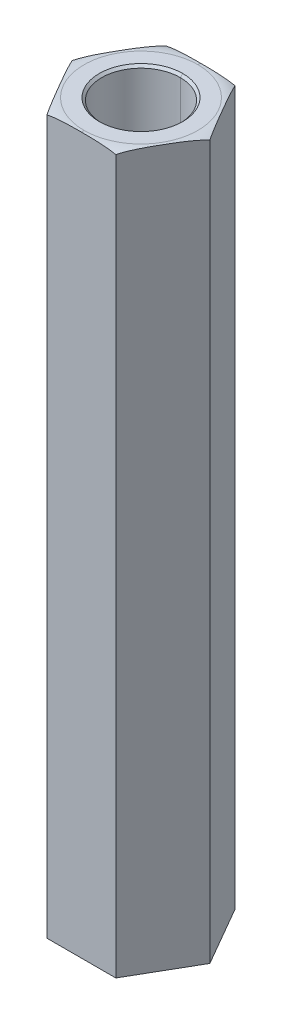
ISO-10303-21;
HEADER;
FILE_DESCRIPTION(('STEP AP214'),'2;1');
FILE_NAME('part.step','',(''),(''),'','','');
FILE_SCHEMA(('AUTOMOTIVE_DESIGN { 1 0 10303 214 1 1 1 1 }'));
ENDSEC;
DATA;
#1=APPLICATION_CONTEXT('core data for automotive mechanical design processes');
#2=APPLICATION_PROTOCOL_DEFINITION('international standard','automotive_design',2000,#1);
#3=PRODUCT_CONTEXT('',#1,'mechanical');
#4=PRODUCT('Part','Part','',(#3));
#5=PRODUCT_RELATED_PRODUCT_CATEGORY('part','',(#4));
#6=PRODUCT_DEFINITION_FORMATION('','',#4);
#7=PRODUCT_DEFINITION_CONTEXT('part definition',#1,'design');
#8=PRODUCT_DEFINITION('design','',#6,#7);
#9=PRODUCT_DEFINITION_SHAPE('','',#8);
#10=(LENGTH_UNIT() NAMED_UNIT(*) SI_UNIT(.MILLI.,.METRE.));
#11=(NAMED_UNIT(*) PLANE_ANGLE_UNIT() SI_UNIT($,.RADIAN.));
#12=(NAMED_UNIT(*) SI_UNIT($,.STERADIAN.) SOLID_ANGLE_UNIT());
#13=UNCERTAINTY_MEASURE_WITH_UNIT(LENGTH_MEASURE(1.E-05),#10,'distance_accuracy_value','');
#14=(GEOMETRIC_REPRESENTATION_CONTEXT(3) GLOBAL_UNCERTAINTY_ASSIGNED_CONTEXT((#13)) GLOBAL_UNIT_ASSIGNED_CONTEXT((#10,
#11,#12)) REPRESENTATION_CONTEXT('',''));
#15=CARTESIAN_POINT('',(0.,0.,0.));
#16=DIRECTION('',(0.,0.,1.));
#17=DIRECTION('',(1.,0.,0.));
#18=AXIS2_PLACEMENT_3D('',#15,#16,#17);
#19=CARTESIAN_POINT('',(-3.66617420935412,76.2,0.));
#20=DIRECTION('',(0.866025403784439,0.,-0.5));
#21=DIRECTION('',(0.,-1.,0.));
#22=AXIS2_PLACEMENT_3D('',#19,#20,#21);
#23=PLANE('',#22);
#24=DIRECTION('',(-0.5,0.,-0.866025403784439));
#25=VECTOR('',#24,1.);
#26=CARTESIAN_POINT('',(-3.66617420935412,38.1,0.));
#27=LINE('',#26,#25);
#28=CARTESIAN_POINT('',(-1.83308710467708,38.1,3.175));
#29=VERTEX_POINT('',#28);
#30=CARTESIAN_POINT('',(-3.66617420935413,38.1,0.));
#31=VERTEX_POINT('',#30);
#32=EDGE_CURVE('E387',#29,#31,#27,.T.);
#33=ORIENTED_EDGE('',*,*,#32,.F.);
#34=DIRECTION('',(0.,1.,0.));
#35=VECTOR('',#34,1.);
#36=CARTESIAN_POINT('',(-1.83308710467708,76.2,3.175));
#37=LINE('',#36,#35);
#38=CARTESIAN_POINT('',(-1.83308710467706,76.073,3.175));
#39=VERTEX_POINT('',#38);
#40=EDGE_CURVE('E57',#29,#39,#37,.T.);
#41=ORIENTED_EDGE('',*,*,#40,.T.);
#42=CARTESIAN_POINT('',(-3.66617420935412,76.073,0.));
#43=CARTESIAN_POINT('',(-3.62852752777413,76.0886774888161,0.0651650175844497));
#44=CARTESIAN_POINT('',(-3.59063825645809,76.1021129162483,0.130678095569553));
#45=CARTESIAN_POINT('',(-3.51465366955102,76.1252207927488,0.262081945129717));
#46=CARTESIAN_POINT('',(-3.47655888890391,76.1349004136586,0.32797175062727));
#47=CARTESIAN_POINT('',(-3.40028117866843,76.1512755376251,0.460088482912216));
#48=CARTESIAN_POINT('',(-3.36209822004462,76.1579698521673,0.526315533370278));
#49=CARTESIAN_POINT('',(-3.28553703394474,76.1690985676939,0.659145882122327));
#50=CARTESIAN_POINT('',(-3.24715858676475,76.173525109243,0.72574969079345));
#51=CARTESIAN_POINT('',(-3.17013720645552,76.1807232490973,0.859167969028904));
#52=CARTESIAN_POINT('',(-3.1314938213222,76.1834896133415,0.925982444133844));
#53=CARTESIAN_POINT('',(-3.05461275530814,76.187809359476,1.05897157909141));
#54=CARTESIAN_POINT('',(-3.01637496107305,76.1893748391711,1.12514580542029));
#55=CARTESIAN_POINT('',(-2.94010013043662,76.1917123281715,1.25726766896534));
#56=CARTESIAN_POINT('',(-2.9020629053945,76.1924875053469,1.3232151463295));
#57=CARTESIAN_POINT('',(-2.82590963462342,76.1934934801607,1.45528703761391));
#58=CARTESIAN_POINT('',(-2.78779362824686,76.1937229185725,1.52141148352469));
#59=CARTESIAN_POINT('',(-2.71134080607808,76.1937239313039,1.65380824205224));
#60=CARTESIAN_POINT('',(-2.67300367247286,76.1934940728267,1.72008037116131));
#61=CARTESIAN_POINT('',(-2.59652315428835,76.1924847717044,1.85233139266062));
#62=CARTESIAN_POINT('',(-2.55837968024612,76.1917078287948,1.91831025043496));
#63=CARTESIAN_POINT('',(-2.48204443723343,76.1893627996394,2.05051676476466));
#64=CARTESIAN_POINT('',(-2.4438529218735,76.1877921203691,2.11674452604261));
#65=CARTESIAN_POINT('',(-2.36710568333616,76.1834548824334,2.24991554859907));
#66=CARTESIAN_POINT('',(-2.32855052590926,76.1806754800541,2.31685874328981));
#67=CARTESIAN_POINT('',(-2.25097444995731,76.1734136053112,2.45117109158841));
#68=CARTESIAN_POINT('',(-2.21195240767693,76.1689164456647,2.5185388478012));
#69=CARTESIAN_POINT('',(-2.13461656999061,76.1576448518415,2.65211930950646));
#70=CARTESIAN_POINT('',(-2.09630105978957,76.1509062465137,2.71833394195186));
#71=CARTESIAN_POINT('',(-2.02028451199559,76.1344745512069,2.85001035979228));
#72=CARTESIAN_POINT('',(-1.98258101883529,76.1248069890922,2.91547376910441));
#73=CARTESIAN_POINT('',(-1.90756346223036,76.1018156431562,3.04575379589234));
#74=CARTESIAN_POINT('',(-1.87024866874892,76.0885009158898,3.11057160864596));
#75=CARTESIAN_POINT('',(-1.83308710467706,76.073,3.175));
#76=B_SPLINE_CURVE_WITH_KNOTS('',3,(#42,#43,#44,#45,#46,#47,#48,#49,#50,#51,#52,#53,#54,#55,#56,
#57,#58,#59,#60,#61,#62,#63,#64,#65,#66,#67,#68,#69,#70,#71,#72,#73,#74,#75),.UNSPECIFIED.,.F.,
.F.,(4,2,2,2,2,2,2,2,2,2,2,2,2,2,2,2,4),(0.,0.230524501201281,0.460606615770978,
0.690780249361266,0.921746290601664,1.15343672728995,1.38276127764194,1.61116293951177,
1.84013286962869,2.06981819670181,2.29846080005103,2.52785522236707,2.75974910407835,
2.99367180754688,3.22402190574997,3.45241944141178,3.68025488817963),.UNSPECIFIED.);
#77=CARTESIAN_POINT('',(-3.66617420935412,76.073,0.));
#78=VERTEX_POINT('',#77);
#79=EDGE_CURVE('E347',#78,#39,#76,.T.);
#80=ORIENTED_EDGE('',*,*,#79,.F.);
#81=DIRECTION('',(0.,-1.,0.));
#82=VECTOR('',#81,1.);
#83=CARTESIAN_POINT('',(-3.66617420935413,76.2,0.));
#84=LINE('',#83,#82);
#85=EDGE_CURVE('E393',#78,#31,#84,.T.);
#86=ORIENTED_EDGE('',*,*,#85,.T.);
#87=EDGE_LOOP('',(#33,#41,#80,#86));
#88=FACE_BOUND('',#87,.T.);
#89=ADVANCED_FACE('F55',(#88),#23,.F.);
#90=CARTESIAN_POINT('',(-1.83308710467706,76.2,-3.175));
#91=DIRECTION('',(0.866025403784439,0.,0.5));
#92=DIRECTION('',(0.,-1.,0.));
#93=AXIS2_PLACEMENT_3D('',#90,#91,#92);
#94=PLANE('',#93);
#95=DIRECTION('',(0.5,0.,-0.866025403784439));
#96=VECTOR('',#95,1.);
#97=CARTESIAN_POINT('',(-1.83308710467706,38.1,-3.175));
#98=LINE('',#97,#96);
#99=CARTESIAN_POINT('',(-1.83308710467704,38.1,-3.175));
#100=VERTEX_POINT('',#99);
#101=EDGE_CURVE('E495',#31,#100,#98,.T.);
#102=ORIENTED_EDGE('',*,*,#101,.F.);
#103=ORIENTED_EDGE('',*,*,#85,.F.);
#104=CARTESIAN_POINT('',(-1.83308710467705,76.073,-3.175));
#105=CARTESIAN_POINT('',(-1.87029641091841,76.0885208398345,-3.11048870002124));
#106=CARTESIAN_POINT('',(-1.90765954903898,76.1018498042125,-3.04558720037253));
#107=CARTESIAN_POINT('',(-1.98277598390404,76.1248614806103,-2.91513670590539));
#108=CARTESIAN_POINT('',(-2.02053002242249,76.1345349955737,-2.84958649814701));
#109=CARTESIAN_POINT('',(-2.09665052530399,76.1509731359405,-2.71773243961721));
#110=CARTESIAN_POINT('',(-2.13501946426464,76.1577120314406,-2.65142695536615));
#111=CARTESIAN_POINT('',(-2.21246390057516,76.1689812955924,-2.51765778576073));
#112=CARTESIAN_POINT('',(-2.25154109297378,76.1734756216343,-2.4501921496318));
#113=CARTESIAN_POINT('',(-2.32911294406295,76.1807192398753,-2.31588204486321));
#114=CARTESIAN_POINT('',(-2.36760910470934,76.1834881555598,-2.24903944072012));
#115=CARTESIAN_POINT('',(-2.44424571284584,76.1878098408839,-2.11606144290717));
#116=CARTESIAN_POINT('',(-2.48238558092739,76.1893752519673,-2.0499261010972));
#117=CARTESIAN_POINT('',(-2.55862160425315,76.191712922053,-1.91789645584361));
#118=CARTESIAN_POINT('',(-2.59671751598941,76.1924876749217,-1.85200205182963));
#119=CARTESIAN_POINT('',(-2.67310404505366,76.1934943976824,-1.71991268600846));
#120=CARTESIAN_POINT('',(-2.71139474300874,76.1937238233541,-1.65371775341467));
#121=CARTESIAN_POINT('',(-2.78784489823357,76.1937230252486,-1.52131977821863));
#122=CARTESIAN_POINT('',(-2.82600443358918,76.1934931535726,-1.4551167807033));
#123=CARTESIAN_POINT('',(-2.90225050434311,76.1924845999971,-1.32288327275756));
#124=CARTESIAN_POINT('',(-2.94033699623329,76.1917072311022,-1.25685272825033));
#125=CARTESIAN_POINT('',(-3.0167153571113,76.1893623795008,-1.12455691587817));
#126=CARTESIAN_POINT('',(-3.05500742159172,76.1877916250156,-1.0582918136033));
#127=CARTESIAN_POINT('',(-3.13200055892338,76.1834563335153,-0.925109760073331));
#128=CARTESIAN_POINT('',(-3.17070172266464,76.1806794880851,-0.858193236417918));
#129=CARTESIAN_POINT('',(-3.24772422503457,76.173463133503,-0.72476697636106));
#130=CARTESIAN_POINT('',(-3.28604644475101,76.1690337907513,-0.658257229550373));
#131=CARTESIAN_POINT('',(-3.36249930308035,76.1579026590942,-0.525612630230573));
#132=CARTESIAN_POINT('',(-3.40063015131929,76.1512086054002,-0.459477270534229));
#133=CARTESIAN_POINT('',(-3.47680543261392,76.1348397722548,-0.327540747638441));
#134=CARTESIAN_POINT('',(-3.51484989147459,76.1251660484383,-0.261739474457937));
#135=CARTESIAN_POINT('',(-3.59073546774609,76.1020784850675,-0.130509138226514));
#136=CARTESIAN_POINT('',(-3.62857603990986,76.0886573463129,-0.0650810584661239));
#137=CARTESIAN_POINT('',(-3.66617420935412,76.073,0.));
#138=B_SPLINE_CURVE_WITH_KNOTS('',3,(#104,#105,#106,#107,#108,#109,#110,#111,#112,#113,#114,
#115,#116,#117,#118,#119,#120,#121,#122,#123,#124,#125,#126,#127,#128,#129,#130,#131,#132,#133,
#134,#135,#136,#137),.UNSPECIFIED.,.F.,.F.,(4,2,2,2,2,2,2,2,2,2,2,2,2,2,2,2,4),(0.,
0.228128202617142,0.456826610205105,0.687491675358769,0.921750310158435,1.15329356509013,
1.38237017488451,1.61072198498895,1.84013709553042,2.06937640208927,2.2980678120892,
2.52771009920558,2.75975312103158,2.99039151034366,3.22024996718918,3.45002708347931,
3.68025491892986),.UNSPECIFIED.);
#139=CARTESIAN_POINT('',(-1.83308710467705,76.073,-3.175));
#140=VERTEX_POINT('',#139);
#141=EDGE_CURVE('E303',#140,#78,#138,.T.);
#142=ORIENTED_EDGE('',*,*,#141,.F.);
#143=DIRECTION('',(0.,-1.,0.));
#144=VECTOR('',#143,1.);
#145=CARTESIAN_POINT('',(-1.83308710467704,76.2,-3.175));
#146=LINE('',#145,#144);
#147=EDGE_CURVE('E181',#140,#100,#146,.T.);
#148=ORIENTED_EDGE('',*,*,#147,.T.);
#149=EDGE_LOOP('',(#102,#103,#142,#148));
#150=FACE_BOUND('',#149,.T.);
#151=ADVANCED_FACE('F228',(#150),#94,.F.);
#152=CARTESIAN_POINT('',(-1.83308710467707,76.2,3.175));
#153=DIRECTION('',(0.,0.,-1.));
#154=DIRECTION('',(-1.,0.,0.));
#155=AXIS2_PLACEMENT_3D('',#152,#153,#154);
#156=PLANE('',#155);
#157=DIRECTION('',(-1.,0.,0.));
#158=VECTOR('',#157,1.);
#159=CARTESIAN_POINT('',(-1.83308710467707,38.1,3.175));
#160=LINE('',#159,#158);
#161=CARTESIAN_POINT('',(1.83308710467706,38.1,3.175));
#162=VERTEX_POINT('',#161);
#163=EDGE_CURVE('E172',#162,#29,#160,.T.);
#164=ORIENTED_EDGE('',*,*,#163,.F.);
#165=DIRECTION('',(0.,1.,0.));
#166=VECTOR('',#165,1.);
#167=CARTESIAN_POINT('',(1.83308710467706,76.2,3.175));
#168=LINE('',#167,#166);
#169=CARTESIAN_POINT('',(1.83308710467706,76.073,3.175));
#170=VERTEX_POINT('',#169);
#171=EDGE_CURVE('E82',#162,#170,#168,.T.);
#172=ORIENTED_EDGE('',*,*,#171,.T.);
#173=CARTESIAN_POINT('',(0.,76.1937234241492,3.175));
#174=CARTESIAN_POINT('',(0.0756305640321452,76.1936960280823,3.17501069278199));
#175=CARTESIAN_POINT('',(0.151262410881451,76.1934824631384,3.17504585249403));
#176=CARTESIAN_POINT('',(0.303192007128639,76.1924892132941,3.17511209744143));
#177=CARTESIAN_POINT('',(0.379489721819273,76.191704531393,3.1751431438341));
#178=CARTESIAN_POINT('',(0.53276574817571,76.1893583720841,3.17514607652628));
#179=CARTESIAN_POINT('',(0.609743963264254,76.1877899213243,3.17511742428739));
#180=CARTESIAN_POINT('',(0.764301489404732,76.18346133646,3.17505000516481));
#181=CARTESIAN_POINT('',(0.841880548843443,76.180691527938,3.1750111572008));
#182=CARTESIAN_POINT('',(0.994691951750941,76.173533383897,3.17498916946454));
#183=CARTESIAN_POINT('',(1.06992650061115,76.169194810616,3.17500443194673));
#184=CARTESIAN_POINT('',(1.22126433668409,76.1582527401453,3.17502192621219));
#185=CARTESIAN_POINT('',(1.29736551787488,76.151619232463,3.17502397789243));
#186=CARTESIAN_POINT('',(1.45012979423013,76.1353375952218,3.17502142630084));
#187=CARTESIAN_POINT('',(1.5267895199563,76.1256562432473,3.17501674755619));
#188=CARTESIAN_POINT('',(1.68014248244779,76.10243900426,3.17500700591373));
#189=CARTESIAN_POINT('',(1.75683109925452,76.0888729569933,3.17500194024686));
#190=CARTESIAN_POINT('',(1.83308710467707,76.073,3.17499999999999));
#191=B_SPLINE_CURVE_WITH_KNOTS('',3,(#173,#174,#175,#176,#177,#178,#179,#180,#181,#182,#183,
#184,#185,#186,#187,#188,#189,#190),.UNSPECIFIED.,.F.,.F.,(4,2,2,2,2,2,2,2,4),(0.,
0.226893512374892,0.455796471177623,0.686773289078327,0.91964571689635,1.14570001146059,
1.3748296962981,1.60654888418629,1.84011829197034),.UNSPECIFIED.);
#192=CARTESIAN_POINT('',(0.,76.1937234241492,3.175));
#193=VERTEX_POINT('',#192);
#194=EDGE_CURVE('E207',#193,#170,#191,.T.);
#195=ORIENTED_EDGE('',*,*,#194,.F.);
#196=CARTESIAN_POINT('',(-1.83308710467706,76.073,3.17499999999999));
#197=CARTESIAN_POINT('',(-1.75683707198954,76.0888716465296,3.1750020283547));
#198=CARTESIAN_POINT('',(-1.68015447671397,76.1024365864212,3.17500785688713));
#199=CARTESIAN_POINT('',(-1.5268091516445,76.1256528031094,3.17501945891771));
#200=CARTESIAN_POINT('',(-1.45015100779301,76.135334017818,3.17502523248822));
#201=CARTESIAN_POINT('',(-1.2973860697604,76.1516161000904,3.17502931622034));
#202=CARTESIAN_POINT('',(-1.22128262971438,76.1582500389527,3.17502770869944));
#203=CARTESIAN_POINT('',(-1.06993719959864,76.1691934350196,3.17500852045277));
#204=CARTESIAN_POINT('',(-0.994697309140619,76.1735328087819,3.17499115375589));
#205=CARTESIAN_POINT('',(-0.841887676523301,76.1806915279377,3.17500911157375));
#206=CARTESIAN_POINT('',(-0.764315740476909,76.1834613786496,3.17504603210459));
#207=CARTESIAN_POINT('',(-0.609767169640868,76.1877900259288,3.17511215999884));
#208=CARTESIAN_POINT('',(-0.53279078442746,76.1893584184998,3.17514142722247));
#209=CARTESIAN_POINT('',(-0.379513933004122,76.1917045538003,3.17514007255007));
#210=CARTESIAN_POINT('',(-0.303213562743493,76.1924892247866,3.17510998257145));
#211=CARTESIAN_POINT('',(-0.151275010800483,76.1934824757255,3.17504525775912));
#212=CARTESIAN_POINT('',(-0.075636863634639,76.1936960254449,3.17501066489789));
#213=CARTESIAN_POINT('',(0.,76.1937234241492,3.17499999999999));
#214=B_SPLINE_CURVE_WITH_KNOTS('',3,(#196,#197,#198,#199,#200,#201,#202,#203,#204,#205,#206,
#207,#208,#209,#210,#211,#212,#213),.UNSPECIFIED.,.F.,.F.,(4,2,2,2,2,2,2,2,4),(0.,
0.233551062017457,0.465265493944746,0.694402051204074,0.920472480614443,1.15332354919113,
1.38429487417038,1.61320579816144,1.84011821010097),.UNSPECIFIED.);
#215=EDGE_CURVE('E356',#39,#193,#214,.T.);
#216=ORIENTED_EDGE('',*,*,#215,.F.);
#217=ORIENTED_EDGE('',*,*,#40,.F.);
#218=EDGE_LOOP('',(#164,#172,#195,#216,#217));
#219=FACE_BOUND('',#218,.T.);
#220=ADVANCED_FACE('F232',(#219),#156,.F.);
#221=CARTESIAN_POINT('',(1.83308710467706,76.2,3.175));
#222=DIRECTION('',(-0.866025403784439,0.,-0.5));
#223=DIRECTION('',(-0.5,0.,0.866025403784439));
#224=AXIS2_PLACEMENT_3D('',#221,#222,#223);
#225=PLANE('',#224);
#226=DIRECTION('',(-0.5,0.,0.866025403784439));
#227=VECTOR('',#226,1.);
#228=CARTESIAN_POINT('',(1.83308710467706,38.1,3.175));
#229=LINE('',#228,#227);
#230=CARTESIAN_POINT('',(3.66617420935412,38.1,0.));
#231=VERTEX_POINT('',#230);
#232=EDGE_CURVE('E167',#231,#162,#229,.T.);
#233=ORIENTED_EDGE('',*,*,#232,.F.);
#234=DIRECTION('',(0.,1.,0.));
#235=VECTOR('',#234,1.);
#236=CARTESIAN_POINT('',(3.66617420935412,76.2,0.));
#237=LINE('',#236,#235);
#238=CARTESIAN_POINT('',(3.66617420935412,76.073,0.));
#239=VERTEX_POINT('',#238);
#240=EDGE_CURVE('E175',#231,#239,#237,.T.);
#241=ORIENTED_EDGE('',*,*,#240,.T.);
#242=CARTESIAN_POINT('',(1.83308710467706,76.0730000000001,3.17499999999999));
#243=CARTESIAN_POINT('',(1.87029641091261,76.0885208398321,3.11048870003145));
#244=CARTESIAN_POINT('',(1.90765954902816,76.1018498042079,3.04558720039353));
#245=CARTESIAN_POINT('',(1.98277598388753,76.1248614806038,2.91513670594145));
#246=CARTESIAN_POINT('',(2.02053002240534,76.134534995567,2.84958649818728));
#247=CARTESIAN_POINT('',(2.09665052528885,76.1509731359346,2.71773243965862));
#248=CARTESIAN_POINT('',(2.13501946425214,76.1577120314356,2.65142695540448));
#249=CARTESIAN_POINT('',(2.21246390056861,76.1689812955898,2.51765778578425));
#250=CARTESIAN_POINT('',(2.2515410929705,76.1734756216333,2.45019214964356));
#251=CARTESIAN_POINT('',(2.3291129440537,76.1807192398752,2.31588204487321));
#252=CARTESIAN_POINT('',(2.36760910469089,76.1834881555596,2.24903944074018));
#253=CARTESIAN_POINT('',(2.44424571281664,76.1878098408838,2.11606144294198));
#254=CARTESIAN_POINT('',(2.48238558089661,76.1893752519672,2.04992610113668));
#255=CARTESIAN_POINT('',(2.55862160422439,76.1917129220529,1.91789645588492));
#256=CARTESIAN_POINT('',(2.59671751596425,76.1924876749216,1.8520020518681));
#257=CARTESIAN_POINT('',(2.67310404503971,76.1934943976823,1.71991268603246));
#258=CARTESIAN_POINT('',(2.71139474300239,76.193723823354,1.65371775342703));
#259=CARTESIAN_POINT('',(2.78784489824092,76.1937230252487,1.52131977820451));
#260=CARTESIAN_POINT('',(2.82600443360262,76.1934931535727,1.45511678067434));
#261=CARTESIAN_POINT('',(2.90225050436333,76.1924845999973,1.32288327270773));
#262=CARTESIAN_POINT('',(2.94033699625418,76.1917072311024,1.25685272819446));
#263=CARTESIAN_POINT('',(3.0167153571294,76.1893623795011,1.12455691582027));
#264=CARTESIAN_POINT('',(3.05500742160634,76.1877916250161,1.0582918135494));
#265=CARTESIAN_POINT('',(3.13200055893077,76.1834563335156,0.925109760040036));
#266=CARTESIAN_POINT('',(3.17070172266832,76.1806794880852,0.858193236401264));
#267=CARTESIAN_POINT('',(3.24772422504703,76.1734631335015,0.724766976349681));
#268=CARTESIAN_POINT('',(3.2860464447759,76.1690337907476,0.658257229527629));
#269=CARTESIAN_POINT('',(3.36249930311969,76.1579026590869,0.525612630190635));
#270=CARTESIAN_POINT('',(3.40063015136067,76.1512086053916,0.459477270488453));
#271=CARTESIAN_POINT('',(3.47680543265247,76.1348397722449,0.327540747589949));
#272=CARTESIAN_POINT('',(3.51484989150829,76.1251660484288,0.261739474412522));
#273=CARTESIAN_POINT('',(3.59073546776478,76.1020784850608,0.130509138198106));
#274=CARTESIAN_POINT('',(3.62857603991845,76.0886573463093,0.0650810584515651));
#275=CARTESIAN_POINT('',(3.66617420935412,76.073,0.));
#276=B_SPLINE_CURVE_WITH_KNOTS('',3,(#242,#243,#244,#245,#246,#247,#248,#249,#250,#251,#252,
#253,#254,#255,#256,#257,#258,#259,#260,#261,#262,#263,#264,#265,#266,#267,#268,#269,#270,#271,
#272,#273,#274,#275),.UNSPECIFIED.,.F.,.F.,(4,2,2,2,2,2,2,2,2,2,2,2,2,2,2,2,4),(0.,
0.228128202581061,0.456826610157141,0.687491675322981,0.921750310158276,1.15329356505008,
1.38237017482994,1.61072198494716,1.84013709553028,2.06937640213682,2.29806781215345,
2.52771009925422,2.75975312103149,2.990391510392,3.22024996725603,3.45002708353087,
3.68025491892952),.UNSPECIFIED.);
#277=EDGE_CURVE('E453',#170,#239,#276,.T.);
#278=ORIENTED_EDGE('',*,*,#277,.F.);
#279=ORIENTED_EDGE('',*,*,#171,.F.);
#280=EDGE_LOOP('',(#233,#241,#278,#279));
#281=FACE_BOUND('',#280,.T.);
#282=ADVANCED_FACE('F171',(#281),#225,.F.);
#283=CARTESIAN_POINT('',(1.83308710467705,76.2,-3.175));
#284=DIRECTION('',(0.,0.,1.));
#285=DIRECTION('',(1.,0.,0.));
#286=AXIS2_PLACEMENT_3D('',#283,#284,#285);
#287=PLANE('',#286);
#288=DIRECTION('',(1.,0.,0.));
#289=VECTOR('',#288,1.);
#290=CARTESIAN_POINT('',(1.83308710467705,38.1,-3.175));
#291=LINE('',#290,#289);
#292=CARTESIAN_POINT('',(1.83308710467706,38.1,-3.175));
#293=VERTEX_POINT('',#292);
#294=EDGE_CURVE('E68',#100,#293,#291,.T.);
#295=ORIENTED_EDGE('',*,*,#294,.F.);
#296=ORIENTED_EDGE('',*,*,#147,.F.);
#297=CARTESIAN_POINT('',(0.,76.1937234241492,-3.175));
#298=CARTESIAN_POINT('',(-0.0756305640355725,76.1936960280823,-3.17501069278198));
#299=CARTESIAN_POINT('',(-0.151262410888306,76.1934824631384,-3.17504585249371));
#300=CARTESIAN_POINT('',(-0.303192007140366,76.1924892132941,-3.17511209744029));
#301=CARTESIAN_POINT('',(-0.379489721832446,76.191704531393,-3.17514314383243));
#302=CARTESIAN_POINT('',(-0.532765748189331,76.1893583720841,-3.17514607652376));
#303=CARTESIAN_POINT('',(-0.609743963276879,76.1877899213243,-3.17511742428454));
#304=CARTESIAN_POINT('',(-0.764301489412483,76.18346133646,-3.17505000516266));
#305=CARTESIAN_POINT('',(-0.841880548847317,76.180691527938,-3.1750111571997));
#306=CARTESIAN_POINT('',(-0.994691951753855,76.1735333838967,-3.17498916946562));
#307=CARTESIAN_POINT('',(-1.06992650061697,76.1691948106153,-3.17500443194896));
#308=CARTESIAN_POINT('',(-1.22126433669406,76.1582527401438,-3.17502192621534));
#309=CARTESIAN_POINT('',(-1.29736551788607,76.1516192324613,-3.17502397789535));
#310=CARTESIAN_POINT('',(-1.45012979424169,76.1353375952198,-3.17502142630292));
#311=CARTESIAN_POINT('',(-1.52678951996699,76.1256562432454,-3.17501674755767));
#312=CARTESIAN_POINT('',(-1.68014248245432,76.1024390042586,-3.17500700591421));
#313=CARTESIAN_POINT('',(-1.75683109925776,76.0888729569926,-3.17500194024692));
#314=CARTESIAN_POINT('',(-1.83308710467706,76.073,-3.175));
#315=B_SPLINE_CURVE_WITH_KNOTS('',3,(#297,#298,#299,#300,#301,#302,#303,#304,#305,#306,#307,
#308,#309,#310,#311,#312,#313,#314),.UNSPECIFIED.,.F.,.F.,(4,2,2,2,2,2,2,2,4),(0.,
0.226893512385175,0.455796471192239,0.686773289089953,0.919645716896352,1.14570001146939,
1.37482969631064,1.60654888419624,1.84011829197028),.UNSPECIFIED.);
#316=CARTESIAN_POINT('',(0.,76.1937234241492,-3.175));
#317=VERTEX_POINT('',#316);
#318=EDGE_CURVE('E369',#317,#140,#315,.T.);
#319=ORIENTED_EDGE('',*,*,#318,.F.);
#320=CARTESIAN_POINT('',(1.83308710467705,76.073,-3.175));
#321=CARTESIAN_POINT('',(1.7568370719874,76.0888716465301,-3.17500202835468));
#322=CARTESIAN_POINT('',(1.68015447670969,76.102436586422,-3.17500785688683));
#323=CARTESIAN_POINT('',(1.52680915163749,76.1256528031107,-3.17501945891676));
#324=CARTESIAN_POINT('',(1.45015100778544,76.1353340178193,-3.17502523248687));
#325=CARTESIAN_POINT('',(1.29738606975306,76.1516161000915,-3.17502931621845));
#326=CARTESIAN_POINT('',(1.22128262970785,76.1582500389537,-3.17502770869739));
#327=CARTESIAN_POINT('',(1.06993719959483,76.1691934350201,-3.17500852045132));
#328=CARTESIAN_POINT('',(0.994697309138708,76.1735328087821,-3.17499115375519));
#329=CARTESIAN_POINT('',(0.841887676520762,76.1806915279377,-3.17500911157448));
#330=CARTESIAN_POINT('',(0.764315740471832,76.1834613786496,-3.17504603210602));
#331=CARTESIAN_POINT('',(0.6097671696326,76.1877900259287,-3.17511216000072));
#332=CARTESIAN_POINT('',(0.532790784418539,76.1893584184998,-3.17514142722414));
#333=CARTESIAN_POINT('',(0.379513932995495,76.1917045538003,-3.17514007255117));
#334=CARTESIAN_POINT('',(0.303213562735812,76.1924892247866,-3.17510998257221));
#335=CARTESIAN_POINT('',(0.151275010795994,76.1934824757255,-3.17504525775934));
#336=CARTESIAN_POINT('',(0.0756368636323945,76.1936960254449,-3.17501066489791));
#337=CARTESIAN_POINT('',(0.,76.1937234241492,-3.175));
#338=B_SPLINE_CURVE_WITH_KNOTS('',3,(#320,#321,#322,#323,#324,#325,#326,#327,#328,#329,#330,
#331,#332,#333,#334,#335,#336,#337),.UNSPECIFIED.,.F.,.F.,(4,2,2,2,2,2,2,2,4),(0.,
0.233551062023992,0.465265493952978,0.694402051209853,0.920472480614462,1.15332354919876,
1.38429487417997,1.61320579816819,1.84011821010099),.UNSPECIFIED.);
#339=CARTESIAN_POINT('',(1.83308710467705,76.073,-3.175));
#340=VERTEX_POINT('',#339);
#341=EDGE_CURVE('E187',#340,#317,#338,.T.);
#342=ORIENTED_EDGE('',*,*,#341,.F.);
#343=DIRECTION('',(0.,-1.,0.));
#344=VECTOR('',#343,1.);
#345=CARTESIAN_POINT('',(1.83308710467705,76.2,-3.175));
#346=LINE('',#345,#344);
#347=EDGE_CURVE('E192',#340,#293,#346,.T.);
#348=ORIENTED_EDGE('',*,*,#347,.T.);
#349=EDGE_LOOP('',(#295,#296,#319,#342,#348));
#350=FACE_BOUND('',#349,.T.);
#351=ADVANCED_FACE('F268',(#350),#287,.F.);
#352=CARTESIAN_POINT('',(3.66617420935412,76.2,0.));
#353=DIRECTION('',(-0.866025403784439,0.,0.5));
#354=DIRECTION('',(0.,1.,0.));
#355=AXIS2_PLACEMENT_3D('',#352,#353,#354);
#356=PLANE('',#355);
#357=DIRECTION('',(0.5,0.,0.866025403784439));
#358=VECTOR('',#357,1.);
#359=CARTESIAN_POINT('',(3.66617420935412,38.1,0.));
#360=LINE('',#359,#358);
#361=EDGE_CURVE('E11',#293,#231,#360,.T.);
#362=ORIENTED_EDGE('',*,*,#361,.F.);
#363=ORIENTED_EDGE('',*,*,#347,.F.);
#364=CARTESIAN_POINT('',(3.66617420935412,76.073,0.));
#365=CARTESIAN_POINT('',(3.62852752776935,76.0886774888182,-0.0651650175925537));
#366=CARTESIAN_POINT('',(3.59063825644769,76.102112916252,-0.130678095585357));
#367=CARTESIAN_POINT('',(3.51465366953226,76.1252207927541,-0.262081945154969));
#368=CARTESIAN_POINT('',(3.47655888888245,76.1349004136641,-0.327971750654227));
#369=CARTESIAN_POINT('',(3.40028117864541,76.1512755376299,-0.460088482937668));
#370=CARTESIAN_POINT('',(3.36209822002277,76.1579698521714,-0.526315533392494));
#371=CARTESIAN_POINT('',(3.28553703393086,76.169098567696,-0.659145882134946));
#372=CARTESIAN_POINT('',(3.2471585867577,76.1735251092439,-0.725749690799702));
#373=CARTESIAN_POINT('',(3.17013720645572,76.180723249097,-0.859167969034512));
#374=CARTESIAN_POINT('',(3.13149382132277,76.1834896133409,-0.925982444145175));
#375=CARTESIAN_POINT('',(3.05461275530834,76.1878093594752,-1.05897157910993));
#376=CARTESIAN_POINT('',(3.01637496107251,76.1893748391704,-1.12514580544028));
#377=CARTESIAN_POINT('',(2.94010013043511,76.1917123281709,-1.25726766898486));
#378=CARTESIAN_POINT('',(2.90206290539275,76.1924875053463,-1.32321514634707));
#379=CARTESIAN_POINT('',(2.82590963462211,76.1934934801603,-1.45528703762434));
#380=CARTESIAN_POINT('',(2.78779362824622,76.1937229185723,-1.52141148352991));
#381=CARTESIAN_POINT('',(2.71134080607341,76.1937239313041,-1.65380824205615));
#382=CARTESIAN_POINT('',(2.67300367246349,76.193494072827,-1.72008037116912));
#383=CARTESIAN_POINT('',(2.59652315427239,76.1924847717049,-1.85233139267306));
#384=CARTESIAN_POINT('',(2.55837968022827,76.1917078287954,-1.91831025044815));
#385=CARTESIAN_POINT('',(2.48204443721485,76.1893627996401,-2.05051676477686));
#386=CARTESIAN_POINT('',(2.44385292185608,76.1877921203699,-2.11674452605307));
#387=CARTESIAN_POINT('',(2.36710568332537,76.1834548824339,-2.24991554860493));
#388=CARTESIAN_POINT('',(2.32855052590397,76.1806754800544,-2.31685874329281));
#389=CARTESIAN_POINT('',(2.25097444995432,76.1734136053102,-2.45117109159978));
#390=CARTESIAN_POINT('',(2.21195240767069,76.1689164456623,-2.51853884782376));
#391=CARTESIAN_POINT('',(2.13461656997857,76.1576448518367,-2.65211930954316));
#392=CARTESIAN_POINT('',(2.09630105977503,76.1509062465081,-2.71833394199153));
#393=CARTESIAN_POINT('',(2.02028451197916,76.1344745512005,-2.85001035983086));
#394=CARTESIAN_POINT('',(1.98258101881946,76.124806989086,-2.91547376913896));
#395=CARTESIAN_POINT('',(1.90756346221997,76.1018156431518,-3.04575379591246));
#396=CARTESIAN_POINT('',(1.87024866874333,76.0885009158874,-3.11057160865575));
#397=CARTESIAN_POINT('',(1.83308710467705,76.073,-3.17500000000001));
#398=B_SPLINE_CURVE_WITH_KNOTS('',3,(#364,#365,#366,#367,#368,#369,#370,#371,#372,#373,#374,
#375,#376,#377,#378,#379,#380,#381,#382,#383,#384,#385,#386,#387,#388,#389,#390,#391,#392,#393,
#394,#395,#396,#397),.UNSPECIFIED.,.F.,.F.,(4,2,2,2,2,2,2,2,2,2,2,2,2,2,2,2,4),(0.,
0.230524501230141,0.460606615808335,0.690780249388324,0.921746290601785,1.15343672730433,
1.38276127766126,1.61116293952639,1.84013286962879,2.06981819671907,2.29846080007304,
2.52785522238285,2.75974910407848,2.99367180758115,3.2240219057959,3.45241944144634,
3.68025488817964),.UNSPECIFIED.);
#399=EDGE_CURVE('E180',#239,#340,#398,.T.);
#400=ORIENTED_EDGE('',*,*,#399,.F.);
#401=ORIENTED_EDGE('',*,*,#240,.F.);
#402=EDGE_LOOP('',(#362,#363,#400,#401));
#403=FACE_BOUND('',#402,.T.);
#404=ADVANCED_FACE('F179',(#403),#356,.F.);
#405=CARTESIAN_POINT('',(0.,63.5,0.));
#406=DIRECTION('',(0.,1.,0.));
#407=DIRECTION('',(1.,0.,0.));
#408=AXIS2_PLACEMENT_3D('',#405,#406,#407);
#409=PLANE('',#408);
#410=CARTESIAN_POINT('',(0.,63.5,0.));
#411=DIRECTION('',(0.,1.,0.));
#412=DIRECTION('',(0.,0.,1.));
#413=AXIS2_PLACEMENT_3D('',#410,#411,#412);
#414=CIRCLE('',#413,2.0955);
#415=CARTESIAN_POINT('',(0.,63.5,2.0955));
#416=VERTEX_POINT('',#415);
#417=CARTESIAN_POINT('',(0.,63.5,-2.0955));
#418=VERTEX_POINT('',#417);
#419=EDGE_CURVE('E61',#416,#418,#414,.T.);
#420=ORIENTED_EDGE('',*,*,#419,.T.);
#421=CARTESIAN_POINT('',(0.,63.5,0.));
#422=DIRECTION('',(0.,1.,0.));
#423=DIRECTION('',(0.,0.,1.));
#424=AXIS2_PLACEMENT_3D('',#421,#422,#423);
#425=CIRCLE('',#424,2.0955);
#426=EDGE_CURVE('E433',#418,#416,#425,.T.);
#427=ORIENTED_EDGE('',*,*,#426,.T.);
#428=EDGE_LOOP('',(#420,#427));
#429=FACE_BOUND('',#428,.T.);
#430=ADVANCED_FACE('F279',(#429),#409,.T.);
#431=CARTESIAN_POINT('',(0.,63.5,0.));
#432=DIRECTION('',(0.,1.,0.));
#433=DIRECTION('',(0.,0.,1.));
#434=AXIS2_PLACEMENT_3D('',#431,#432,#433);
#435=CYLINDRICAL_SURFACE('',#434,2.0955);
#436=DIRECTION('',(0.,1.,0.));
#437=VECTOR('',#436,1.);
#438=CARTESIAN_POINT('',(0.,63.5,-2.0955));
#439=LINE('',#438,#437);
#440=CARTESIAN_POINT('',(0.,76.0729999999512,-2.09549999993897));
#441=VERTEX_POINT('',#440);
#442=EDGE_CURVE('E437',#418,#441,#439,.T.);
#443=ORIENTED_EDGE('',*,*,#442,.F.);
#444=ORIENTED_EDGE('',*,*,#419,.F.);
#445=DIRECTION('',(0.,1.,0.));
#446=VECTOR('',#445,1.);
#447=CARTESIAN_POINT('',(0.,63.5,2.0955));
#448=LINE('',#447,#446);
#449=CARTESIAN_POINT('',(0.,76.0729999999512,2.09549999993897));
#450=VERTEX_POINT('',#449);
#451=EDGE_CURVE('E445',#416,#450,#448,.T.);
#452=ORIENTED_EDGE('',*,*,#451,.T.);
#453=CARTESIAN_POINT('',(0.,76.0729999999512,0.));
#454=DIRECTION('',(0.,1.,0.));
#455=DIRECTION('',(0.,0.,1.));
#456=AXIS2_PLACEMENT_3D('',#453,#454,#455);
#457=CIRCLE('',#456,2.09549999993897);
#458=EDGE_CURVE('E149',#450,#441,#457,.T.);
#459=ORIENTED_EDGE('',*,*,#458,.T.);
#460=EDGE_LOOP('',(#443,#444,#452,#459));
#461=FACE_BOUND('',#460,.T.);
#462=ADVANCED_FACE('F53',(#461),#435,.F.);
#463=CARTESIAN_POINT('',(0.,76.1999999999716,0.));
#464=DIRECTION('',(0.,1.,0.));
#465=DIRECTION('',(0.,0.,1.));
#466=AXIS2_PLACEMENT_3D('',#463,#464,#465);
#467=CONICAL_SURFACE('',#466,2.22249999995938,0.785398163397448);
#468=DIRECTION('',(0.,0.707106781186548,-0.707106781186548));
#469=VECTOR('',#468,1.);
#470=CARTESIAN_POINT('',(0.,76.1999999999716,-2.22249999995938));
#471=LINE('',#470,#469);
#472=CARTESIAN_POINT('',(0.,76.2000000000285,-2.22250000001622));
#473=VERTEX_POINT('',#472);
#474=EDGE_CURVE('E485',#441,#473,#471,.T.);
#475=ORIENTED_EDGE('',*,*,#474,.F.);
#476=ORIENTED_EDGE('',*,*,#458,.F.);
#477=DIRECTION('',(0.,0.707106781186548,0.707106781186548));
#478=VECTOR('',#477,1.);
#479=CARTESIAN_POINT('',(0.,76.1999999999716,2.22249999995938));
#480=LINE('',#479,#478);
#481=CARTESIAN_POINT('',(0.,76.2000000000285,2.22250000001622));
#482=VERTEX_POINT('',#481);
#483=EDGE_CURVE('E443',#450,#482,#480,.T.);
#484=ORIENTED_EDGE('',*,*,#483,.T.);
#485=CARTESIAN_POINT('',(0.,76.2000000000285,0.));
#486=DIRECTION('',(0.,1.,0.));
#487=DIRECTION('',(0.,0.,1.));
#488=AXIS2_PLACEMENT_3D('',#485,#486,#487);
#489=CIRCLE('',#488,2.22250000001622);
#490=EDGE_CURVE('E142',#482,#473,#489,.T.);
#491=ORIENTED_EDGE('',*,*,#490,.T.);
#492=EDGE_LOOP('',(#475,#476,#484,#491));
#493=FACE_BOUND('',#492,.T.);
#494=ADVANCED_FACE('F282',(#493),#467,.F.);
#495=CARTESIAN_POINT('',(-1.83308710467706,76.2,-3.175));
#496=DIRECTION('',(0.,-1.,0.));
#497=DIRECTION('',(0.,0.,-1.));
#498=AXIS2_PLACEMENT_3D('',#495,#496,#497);
#499=PLANE('',#498);
#500=ORIENTED_EDGE('',*,*,#490,.F.);
#501=CARTESIAN_POINT('',(0.,76.2000000000285,0.));
#502=DIRECTION('',(0.,1.,0.));
#503=DIRECTION('',(0.,0.,1.));
#504=AXIS2_PLACEMENT_3D('',#501,#502,#503);
#505=CIRCLE('',#504,2.22250000001622);
#506=EDGE_CURVE('E447',#473,#482,#505,.T.);
#507=ORIENTED_EDGE('',*,*,#506,.F.);
#508=EDGE_LOOP('',(#500,#507));
#509=FACE_BOUND('',#508,.T.);
#510=CARTESIAN_POINT('',(0.,76.2,3.03117420935411));
#511=CARTESIAN_POINT('',(-6.06234841870824,76.1999999999999,3.03117420935412));
#512=CARTESIAN_POINT('',(-6.06234841870824,76.1999999999999,-3.03117420935412));
#513=CARTESIAN_POINT('',(0.,76.2,-3.03117420935411));
#514=(BOUNDED_CURVE() B_SPLINE_CURVE(3,(#510,#511,#512,#513),.UNSPECIFIED.,.F.,
.F.) B_SPLINE_CURVE_WITH_KNOTS((4,4),(0.,1.),
.UNSPECIFIED.) CURVE() GEOMETRIC_REPRESENTATION_ITEM() RATIONAL_B_SPLINE_CURVE((1.,
0.333333333333334,0.333333333333334,1.)) REPRESENTATION_ITEM(''));
#515=CARTESIAN_POINT('',(0.,76.2,3.03117420935411));
#516=VERTEX_POINT('',#515);
#517=CARTESIAN_POINT('',(0.,76.2,-3.03117420935411));
#518=VERTEX_POINT('',#517);
#519=EDGE_CURVE('E377',#516,#518,#514,.T.);
#520=ORIENTED_EDGE('',*,*,#519,.F.);
#521=CARTESIAN_POINT('',(0.,76.2,-3.03117420935411));
#522=CARTESIAN_POINT('',(6.06234841870824,76.1999999999999,-3.03117420935412));
#523=CARTESIAN_POINT('',(6.06234841870824,76.1999999999999,3.03117420935412));
#524=CARTESIAN_POINT('',(0.,76.2,3.03117420935411));
#525=(BOUNDED_CURVE() B_SPLINE_CURVE(3,(#521,#522,#523,#524),.UNSPECIFIED.,.F.,
.F.) B_SPLINE_CURVE_WITH_KNOTS((4,4),(0.,1.),
.UNSPECIFIED.) CURVE() GEOMETRIC_REPRESENTATION_ITEM() RATIONAL_B_SPLINE_CURVE((1.,
0.333333333333334,0.333333333333334,1.)) REPRESENTATION_ITEM(''));
#526=EDGE_CURVE('E458',#518,#516,#525,.T.);
#527=ORIENTED_EDGE('',*,*,#526,.F.);
#528=EDGE_LOOP('',(#520,#527));
#529=FACE_BOUND('',#528,.T.);
#530=ADVANCED_FACE('F230',(#509,#529),#499,.F.);
#531=CARTESIAN_POINT('',(0.,76.2,3.03117420935412));
#532=CARTESIAN_POINT('',(6.06234841870824,76.1999999999999,3.03117420935412));
#533=CARTESIAN_POINT('',(6.06234841870824,76.1999999999999,-3.03117420935412));
#534=CARTESIAN_POINT('',(0.,76.2,-3.03117420935412));
#535=CARTESIAN_POINT('',(0.,76.2,3.25119342275333));
#536=CARTESIAN_POINT('',(6.50238684550666,76.1999999999999,3.25119342275333));
#537=CARTESIAN_POINT('',(6.50238684550666,76.1999999999999,-3.25119342275333));
#538=CARTESIAN_POINT('',(0.,76.2,-3.25119342275333));
#539=CARTESIAN_POINT('',(0.,76.1565951880231,3.46688875548461));
#540=CARTESIAN_POINT('',(6.93377751096923,76.1565951880232,3.46688875548461));
#541=CARTESIAN_POINT('',(6.93377751096923,76.1565951880232,-3.46688875548461));
#542=CARTESIAN_POINT('',(0.,76.1565951880231,-3.46688875548461));
#543=CARTESIAN_POINT('',(0.,76.0714915716903,3.66978239449747));
#544=CARTESIAN_POINT('',(7.33956478899495,76.0714915716902,3.66978239449747));
#545=CARTESIAN_POINT('',(7.33956478899495,76.0714915716902,-3.66978239449747));
#546=CARTESIAN_POINT('',(0.,76.0714915716903,-3.66978239449747));
#547=(BOUNDED_SURFACE() B_SPLINE_SURFACE(3,3,((#531,#532,#533,#534),(#535,#536,#537,#538),(#539,
#540,#541,#542),(#543,#544,#545,#546)),.UNSPECIFIED.,.F.,.F.,
.F.) B_SPLINE_SURFACE_WITH_KNOTS((4,4),(4,4),(0.,1.),(0.,1.),
.UNSPECIFIED.) GEOMETRIC_REPRESENTATION_ITEM() RATIONAL_B_SPLINE_SURFACE(((1.,0.333333333333334,
0.333333333333334,1.),(0.98689847551305,0.32896615850435,0.32896615850435,0.98689847551305),
(0.98689847551305,0.32896615850435,0.32896615850435,0.98689847551305),(1.,0.333333333333334,
0.333333333333334,1.))) REPRESENTATION_ITEM('') SURFACE());
#548=CARTESIAN_POINT('',(0.,74.549,-3.03117420935405));
#549=DIRECTION('',(-1.,0.,0.));
#550=DIRECTION('',(0.,0.,-1.));
#551=AXIS2_PLACEMENT_3D('',#548,#549,#550);
#552=CIRCLE('',#551,1.65100000000048);
#553=EDGE_CURVE('E373',#518,#317,#552,.T.);
#554=CARTESIAN_POINT('',(0.,74.549,3.03117420935405));
#555=DIRECTION('',(1.,0.,0.));
#556=DIRECTION('',(0.,0.,1.));
#557=AXIS2_PLACEMENT_3D('',#554,#555,#556);
#558=CIRCLE('',#557,1.65100000000048);
#559=EDGE_CURVE('E358',#516,#193,#558,.T.);
#560=ORIENTED_EDGE('',*,*,#553,.F.);
#561=ORIENTED_EDGE('',*,*,#526,.T.);
#562=ORIENTED_EDGE('',*,*,#559,.T.);
#563=ORIENTED_EDGE('',*,*,#194,.T.);
#564=ORIENTED_EDGE('',*,*,#277,.T.);
#565=ORIENTED_EDGE('',*,*,#399,.T.);
#566=ORIENTED_EDGE('',*,*,#341,.T.);
#567=EDGE_LOOP('',(#560,#561,#562,#563,#564,#565,#566));
#568=FACE_BOUND('',#567,.T.);
#569=ADVANCED_FACE('F214',(#568),#547,.T.);
#570=CARTESIAN_POINT('',(0.,63.5,0.));
#571=DIRECTION('',(0.,1.,0.));
#572=DIRECTION('',(0.,0.,1.));
#573=AXIS2_PLACEMENT_3D('',#570,#571,#572);
#574=CYLINDRICAL_SURFACE('',#573,2.0955);
#575=ORIENTED_EDGE('',*,*,#426,.F.);
#576=ORIENTED_EDGE('',*,*,#442,.T.);
#577=CARTESIAN_POINT('',(0.,76.0729999999512,0.));
#578=DIRECTION('',(0.,1.,0.));
#579=DIRECTION('',(0.,0.,1.));
#580=AXIS2_PLACEMENT_3D('',#577,#578,#579);
#581=CIRCLE('',#580,2.09549999993897);
#582=EDGE_CURVE('E365',#441,#450,#581,.T.);
#583=ORIENTED_EDGE('',*,*,#582,.T.);
#584=ORIENTED_EDGE('',*,*,#451,.F.);
#585=EDGE_LOOP('',(#575,#576,#583,#584));
#586=FACE_BOUND('',#585,.T.);
#587=ADVANCED_FACE('F226',(#586),#574,.F.);
#588=CARTESIAN_POINT('',(0.,76.1999999999716,0.));
#589=DIRECTION('',(0.,1.,0.));
#590=DIRECTION('',(0.,0.,1.));
#591=AXIS2_PLACEMENT_3D('',#588,#589,#590);
#592=CONICAL_SURFACE('',#591,2.22249999995938,0.785398163397448);
#593=ORIENTED_EDGE('',*,*,#582,.F.);
#594=ORIENTED_EDGE('',*,*,#474,.T.);
#595=ORIENTED_EDGE('',*,*,#506,.T.);
#596=ORIENTED_EDGE('',*,*,#483,.F.);
#597=EDGE_LOOP('',(#593,#594,#595,#596));
#598=FACE_BOUND('',#597,.T.);
#599=ADVANCED_FACE('F319',(#598),#592,.F.);
#600=CARTESIAN_POINT('',(0.,76.2,-3.03117420935412));
#601=CARTESIAN_POINT('',(-6.06234841870824,76.1999999999999,-3.03117420935412));
#602=CARTESIAN_POINT('',(-6.06234841870824,76.1999999999999,3.03117420935412));
#603=CARTESIAN_POINT('',(0.,76.2,3.03117420935412));
#604=CARTESIAN_POINT('',(0.,76.2,-3.25119342275333));
#605=CARTESIAN_POINT('',(-6.50238684550666,76.1999999999999,-3.25119342275333));
#606=CARTESIAN_POINT('',(-6.50238684550666,76.1999999999999,3.25119342275333));
#607=CARTESIAN_POINT('',(0.,76.2,3.25119342275333));
#608=CARTESIAN_POINT('',(0.,76.1565951880231,-3.46688875548462));
#609=CARTESIAN_POINT('',(-6.93377751096924,76.1565951880232,-3.46688875548462));
#610=CARTESIAN_POINT('',(-6.93377751096924,76.1565951880232,3.46688875548461));
#611=CARTESIAN_POINT('',(0.,76.1565951880231,3.46688875548462));
#612=CARTESIAN_POINT('',(0.,76.0714915716903,-3.66978239449748));
#613=CARTESIAN_POINT('',(-7.33956478899496,76.0714915716902,-3.66978239449748));
#614=CARTESIAN_POINT('',(-7.33956478899496,76.0714915716902,3.66978239449748));
#615=CARTESIAN_POINT('',(0.,76.0714915716903,3.66978239449748));
#616=(BOUNDED_SURFACE() B_SPLINE_SURFACE(3,3,((#600,#601,#602,#603),(#604,#605,#606,#607),(#608,
#609,#610,#611),(#612,#613,#614,#615)),.UNSPECIFIED.,.F.,.F.,
.F.) B_SPLINE_SURFACE_WITH_KNOTS((4,4),(4,4),(0.,1.),(0.,1.),
.UNSPECIFIED.) GEOMETRIC_REPRESENTATION_ITEM() RATIONAL_B_SPLINE_SURFACE(((1.,0.333333333333334,
0.333333333333334,1.),(0.98689847551305,0.32896615850435,0.32896615850435,0.98689847551305),
(0.98689847551305,0.32896615850435,0.32896615850435,0.98689847551305),(1.,0.333333333333334,
0.333333333333334,1.))) REPRESENTATION_ITEM('') SURFACE());
#617=ORIENTED_EDGE('',*,*,#519,.T.);
#618=ORIENTED_EDGE('',*,*,#553,.T.);
#619=ORIENTED_EDGE('',*,*,#318,.T.);
#620=ORIENTED_EDGE('',*,*,#141,.T.);
#621=ORIENTED_EDGE('',*,*,#79,.T.);
#622=ORIENTED_EDGE('',*,*,#215,.T.);
#623=ORIENTED_EDGE('',*,*,#559,.F.);
#624=EDGE_LOOP('',(#617,#618,#619,#620,#621,#622,#623));
#625=FACE_BOUND('',#624,.T.);
#626=ADVANCED_FACE('F310',(#625),#616,.T.);
#627=CARTESIAN_POINT('',(0.,38.1,0.));
#628=DIRECTION('',(0.,-1.,0.));
#629=DIRECTION('',(0.,0.,-1.));
#630=AXIS2_PLACEMENT_3D('',#627,#628,#629);
#631=PLANE('',#630);
#632=ORIENTED_EDGE('',*,*,#32,.T.);
#633=ORIENTED_EDGE('',*,*,#101,.T.);
#634=ORIENTED_EDGE('',*,*,#294,.T.);
#635=ORIENTED_EDGE('',*,*,#361,.T.);
#636=ORIENTED_EDGE('',*,*,#232,.T.);
#637=ORIENTED_EDGE('',*,*,#163,.T.);
#638=EDGE_LOOP('',(#632,#633,#634,#635,#636,#637));
#639=FACE_BOUND('',#638,.T.);
#640=ADVANCED_FACE('F164',(#639),#631,.T.);
#641=CLOSED_SHELL('',(#89,#151,#220,#282,#351,#404,#430,#462,#494,#530,#569,#587,#599,#626,#640));
#642=MANIFOLD_SOLID_BREP('B2',#641);
#643=ADVANCED_BREP_SHAPE_REPRESENTATION('',(#18,#642),#14);
#644=SHAPE_DEFINITION_REPRESENTATION(#9,#643);
ENDSEC;
END-ISO-10303-21;
